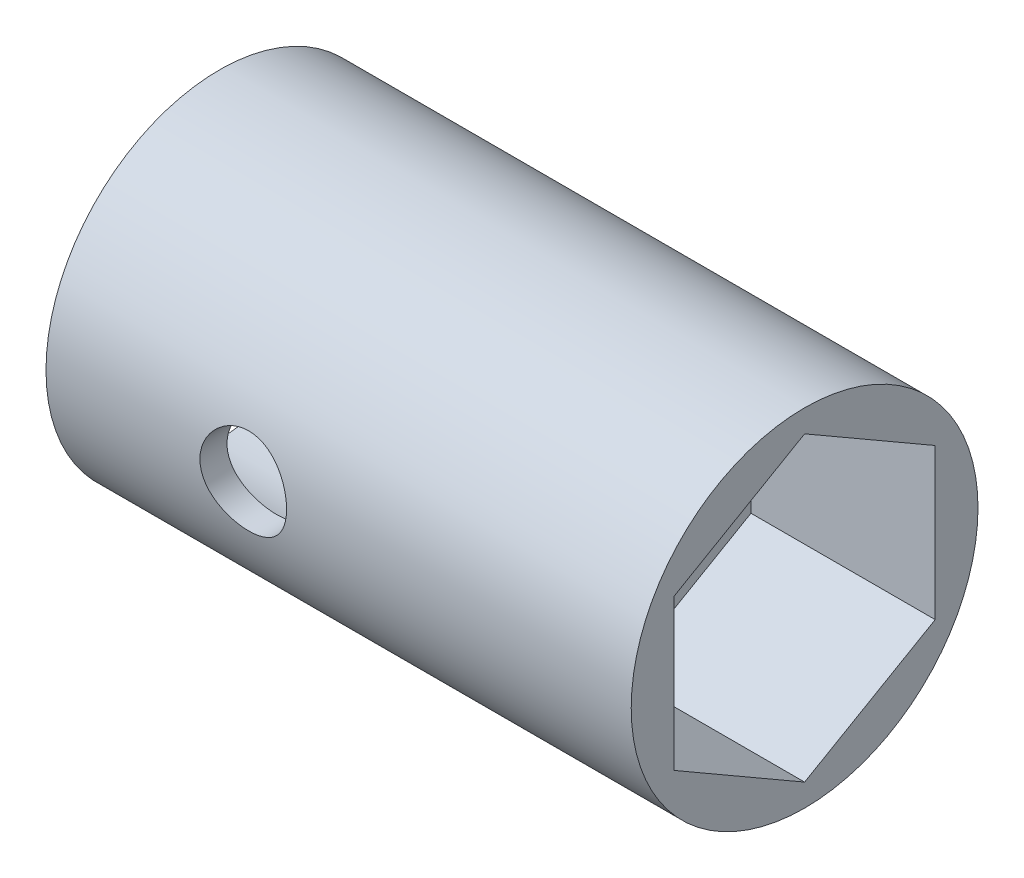
ISO-10303-21;
HEADER;
FILE_DESCRIPTION(('STEP AP214'),'2;1');
FILE_NAME('part.step','',(''),(''),'','','');
FILE_SCHEMA(('AUTOMOTIVE_DESIGN { 1 0 10303 214 1 1 1 1 }'));
ENDSEC;
DATA;
#1=APPLICATION_CONTEXT('core data for automotive mechanical design processes');
#2=APPLICATION_PROTOCOL_DEFINITION('international standard','automotive_design',2000,#1);
#3=PRODUCT_CONTEXT('',#1,'mechanical');
#4=PRODUCT('Part','Part','',(#3));
#5=PRODUCT_RELATED_PRODUCT_CATEGORY('part','',(#4));
#6=PRODUCT_DEFINITION_FORMATION('','',#4);
#7=PRODUCT_DEFINITION_CONTEXT('part definition',#1,'design');
#8=PRODUCT_DEFINITION('design','',#6,#7);
#9=PRODUCT_DEFINITION_SHAPE('','',#8);
#10=(LENGTH_UNIT() NAMED_UNIT(*) SI_UNIT(.MILLI.,.METRE.));
#11=(NAMED_UNIT(*) PLANE_ANGLE_UNIT() SI_UNIT($,.RADIAN.));
#12=(NAMED_UNIT(*) SI_UNIT($,.STERADIAN.) SOLID_ANGLE_UNIT());
#13=UNCERTAINTY_MEASURE_WITH_UNIT(LENGTH_MEASURE(1.E-05),#10,'distance_accuracy_value','');
#14=(GEOMETRIC_REPRESENTATION_CONTEXT(3) GLOBAL_UNCERTAINTY_ASSIGNED_CONTEXT((#13)) GLOBAL_UNIT_ASSIGNED_CONTEXT((#10,
#11,#12)) REPRESENTATION_CONTEXT('',''));
#15=CARTESIAN_POINT('',(0.,0.,0.));
#16=DIRECTION('',(0.,0.,1.));
#17=DIRECTION('',(1.,0.,0.));
#18=AXIS2_PLACEMENT_3D('',#15,#16,#17);
#19=CARTESIAN_POINT('',(20.,0.,0.));
#20=DIRECTION('',(-1.,0.,0.));
#21=DIRECTION('',(0.,0.,1.));
#22=AXIS2_PLACEMENT_3D('',#19,#20,#21);
#23=CYLINDRICAL_SURFACE('',#22,8.);
#24=CARTESIAN_POINT('',(20.,0.,0.));
#25=DIRECTION('',(1.,0.,0.));
#26=DIRECTION('',(0.,0.,-1.));
#27=AXIS2_PLACEMENT_3D('',#24,#25,#26);
#28=CIRCLE('',#27,8.);
#29=CARTESIAN_POINT('',(20.,0.,-8.));
#30=VERTEX_POINT('',#29);
#31=EDGE_CURVE('E11',#30,#30,#28,.T.);
#32=ORIENTED_EDGE('',*,*,#31,.F.);
#33=EDGE_LOOP('',(#32));
#34=FACE_BOUND('',#33,.T.);
#35=CARTESIAN_POINT('',(0.0999999999999998,0.,-8.));
#36=CARTESIAN_POINT('',(0.100003100984211,0.110501451559641,-7.9999981315735));
#37=CARTESIAN_POINT('',(0.10918873436505,0.221037543774351,-7.99768770842435));
#38=CARTESIAN_POINT('',(0.145633535076007,0.438941765027377,-7.98869485106526));
#39=CARTESIAN_POINT('',(0.172902946050467,0.546308062494319,-7.98200993893301));
#40=CARTESIAN_POINT('',(0.244585671282781,0.754694496243436,-7.96500835109376));
#41=CARTESIAN_POINT('',(0.288978398287026,0.855722084573336,-7.95469603789411));
#42=CARTESIAN_POINT('',(0.393575186726456,1.04889617587257,-7.93153791743495));
#43=CARTESIAN_POINT('',(0.453779781491956,1.14104237913168,-7.91869202472209));
#44=CARTESIAN_POINT('',(0.589601052872241,1.31573590306789,-7.89156551455591));
#45=CARTESIAN_POINT('',(0.665482099945414,1.39807425341474,-7.87726276197502));
#46=CARTESIAN_POINT('',(0.829936273212046,1.54899856960443,-7.84898160157248));
#47=CARTESIAN_POINT('',(0.918510830595915,1.61758298259892,-7.83500323053157));
#48=CARTESIAN_POINT('',(1.10746030231599,1.74003539039863,-7.80873034264225));
#49=CARTESIAN_POINT('',(1.20799097441164,1.79366962123352,-7.79646392619748));
#50=CARTESIAN_POINT('',(1.41699788221338,1.88319587806766,-7.77532659757355));
#51=CARTESIAN_POINT('',(1.52547284444269,1.91909074058685,-7.76645514259225));
#52=CARTESIAN_POINT('',(1.74499133093555,1.97140644907302,-7.7533396892843));
#53=CARTESIAN_POINT('',(1.85593986138399,1.98820302444274,-7.74900654662681));
#54=CARTESIAN_POINT('',(2.07915809199913,2.00301570008855,-7.74519149946122));
#55=CARTESIAN_POINT('',(2.19142757425618,2.00103485575748,-7.74570880570571));
#56=CARTESIAN_POINT('',(2.4112210769938,1.97864869951961,-7.75145607355756));
#57=CARTESIAN_POINT('',(2.51879416195377,1.95869112025418,-7.75657150676391));
#58=CARTESIAN_POINT('',(2.72901473454808,1.90163224920399,-7.77075612894758));
#59=CARTESIAN_POINT('',(2.83166187070523,1.86452973609252,-7.77982559958985));
#60=CARTESIAN_POINT('',(3.03031735500284,1.77385263724958,-7.80100151874212));
#61=CARTESIAN_POINT('',(3.12624822905276,1.72011555631056,-7.81313769959755));
#62=CARTESIAN_POINT('',(3.30789161300909,1.59780836801993,-7.83906281127988));
#63=CARTESIAN_POINT('',(3.39360233075634,1.52923566507845,-7.85285203112837));
#64=CARTESIAN_POINT('',(3.55493815425921,1.37688456624163,-7.88101174053188));
#65=CARTESIAN_POINT('',(3.63020598674847,1.29272834422115,-7.89538759304001));
#66=CARTESIAN_POINT('',(3.7656283232852,1.11281589000493,-7.92274620771675));
#67=CARTESIAN_POINT('',(3.82578236568475,1.01705930361059,-7.93572892732543));
#68=CARTESIAN_POINT('',(3.92940078163252,0.816154518241856,-7.9589030945892));
#69=CARTESIAN_POINT('',(3.97280712033924,0.710975190944831,-7.96908480170303));
#70=CARTESIAN_POINT('',(4.04122307427943,0.49450134419051,-7.98543889321888));
#71=CARTESIAN_POINT('',(4.06623620855752,0.383207998867312,-7.99161204452374));
#72=CARTESIAN_POINT('',(4.09661008741178,0.160719960520035,-7.999139990285));
#73=CARTESIAN_POINT('',(4.1024573681004,0.0495956266509453,-8.00061404677705));
#74=CARTESIAN_POINT('',(4.09566799725935,-0.172043833068678,-7.99891739752601));
#75=CARTESIAN_POINT('',(4.08303300960116,-0.282559012859461,-7.99574710989128));
#76=CARTESIAN_POINT('',(4.04003878881149,-0.498152358368656,-7.98519441503143));
#77=CARTESIAN_POINT('',(4.00994498203069,-0.603286825291673,-7.97787512247748));
#78=CARTESIAN_POINT('',(3.93319055462874,-0.807009723270015,-7.95984942178845));
#79=CARTESIAN_POINT('',(3.88652826091577,-0.905597492043513,-7.94914267159856));
#80=CARTESIAN_POINT('',(3.7770184948337,-1.0953641792398,-7.92524410568414));
#81=CARTESIAN_POINT('',(3.71389851680432,-1.18638058911444,-7.91201156489243));
#82=CARTESIAN_POINT('',(3.57361345493737,-1.35670215152433,-7.88459345583226));
#83=CARTESIAN_POINT('',(3.49644594717746,-1.43600527863068,-7.87040772335606));
#84=CARTESIAN_POINT('',(3.32799738554071,-1.58265409076364,-7.84225275947695));
#85=CARTESIAN_POINT('',(3.23641639599677,-1.64965849016271,-7.82829738916375));
#86=CARTESIAN_POINT('',(3.04302315404571,-1.7673476786836,-7.80257171169652));
#87=CARTESIAN_POINT('',(2.94121135605366,-1.81803319221058,-7.79080130756035));
#88=CARTESIAN_POINT('',(2.7307923701159,-1.90126856081239,-7.77090792979553));
#89=CARTESIAN_POINT('',(2.62222982887466,-1.93392586220542,-7.76276340389207));
#90=CARTESIAN_POINT('',(2.40092048281452,-1.98046087993837,-7.75102325453578));
#91=CARTESIAN_POINT('',(2.28817459862335,-1.99434270330488,-7.74742663626581));
#92=CARTESIAN_POINT('',(2.06517196819306,-2.00271812044533,-7.74526534938609));
#93=CARTESIAN_POINT('',(1.95493675316703,-1.99775719704016,-7.74655910304352));
#94=CARTESIAN_POINT('',(1.73692814844269,-1.96983637108382,-7.7537054534379));
#95=CARTESIAN_POINT('',(1.62915470931513,-1.94687683024903,-7.75955795855809));
#96=CARTESIAN_POINT('',(1.41972205457946,-1.88390842592373,-7.77508347576963));
#97=CARTESIAN_POINT('',(1.31803025967972,-1.84400187290717,-7.78473353648412));
#98=CARTESIAN_POINT('',(1.12271282304841,-1.74835321814009,-7.80677007633105));
#99=CARTESIAN_POINT('',(1.02908830241744,-1.69260892004558,-7.81915693494364));
#100=CARTESIAN_POINT('',(0.849927161330639,-1.56515699818285,-7.8456751235135));
#101=CARTESIAN_POINT('',(0.764665235434722,-1.49307088388301,-7.85984353109009));
#102=CARTESIAN_POINT('',(0.607270606939457,-1.33571916158631,-7.88810702995048));
#103=CARTESIAN_POINT('',(0.535141026516041,-1.25045042834819,-7.90220210302746));
#104=CARTESIAN_POINT('',(0.404784921913857,-1.06729011560345,-7.92903540863551));
#105=CARTESIAN_POINT('',(0.346833848437894,-0.969197896421849,-7.94174444487824));
#106=CARTESIAN_POINT('',(0.248336716079293,-0.764354746013968,-7.96406566633491));
#107=CARTESIAN_POINT('',(0.207778185801952,-0.657610084582319,-7.97368006933042));
#108=CARTESIAN_POINT('',(0.151237559560462,-0.459213670991295,-7.98730746087389));
#109=CARTESIAN_POINT('',(0.132065009262089,-0.368506894544091,-7.9920344673692));
#110=CARTESIAN_POINT('',(0.106445408504078,-0.185208095381711,-7.99838140309264));
#111=CARTESIAN_POINT('',(0.0999974009262649,-0.0926162149901548,-8.00000156601193));
#112=CARTESIAN_POINT('',(0.0999999999999998,0.,-8.));
#113=B_SPLINE_CURVE_WITH_KNOTS('',3,(#35,#36,#37,#38,#39,#40,#41,#42,#43,#44,#45,#46,#47,#48,
#49,#50,#51,#52,#53,#54,#55,#56,#57,#58,#59,#60,#61,#62,#63,#64,#65,#66,#67,#68,#69,#70,#71,#72,
#73,#74,#75,#76,#77,#78,#79,#80,#81,#82,#83,#84,#85,#86,#87,#88,#89,#90,#91,#92,#93,#94,#95,#96,
#97,#98,#99,#100,#101,#102,#103,#104,#105,#106,#107,#108,#109,#110,#111,#112),.UNSPECIFIED.,.T.,
.F.,(4,2,2,2,2,2,2,2,2,2,2,2,2,2,2,2,2,2,2,2,2,2,2,2,2,2,2,2,2,2,2,2,2,2,2,2,2,2,4),(0.,
0.33116494996252,0.662517650351866,0.993473203048141,1.32443992022577,1.66152580582852,
1.99864972773416,2.34078196727742,2.68285948225824,3.01808393468093,3.3532538415469,
3.68029996013785,4.00736937959146,4.337740371696,4.66816921119311,5.00802001296453,
5.34788119415424,5.6889097201658,6.02987298255951,6.36211078603463,6.69431868154751,
7.02160366023144,7.34892169767482,7.68204783424897,8.01523150681786,8.35659345610396,
8.69794025003772,9.03723006156476,9.37644564340971,9.70591707202578,10.0353818794581,
10.3628853408369,10.6904342418696,11.0265276855097,11.3627009303165,11.7049624733721,
12.0469781843289,12.3245632392729,12.6021274139515),.UNSPECIFIED.);
#114=CARTESIAN_POINT('',(0.0999999999999998,0.,-8.));
#115=VERTEX_POINT('',#114);
#116=EDGE_CURVE('E184',#115,#115,#113,.T.);
#117=ORIENTED_EDGE('',*,*,#116,.F.);
#118=EDGE_LOOP('',(#117));
#119=FACE_BOUND('',#118,.T.);
#120=CARTESIAN_POINT('',(4.1,0.,8.));
#121=CARTESIAN_POINT('',(4.09999689901579,0.110501451559641,7.9999981315735));
#122=CARTESIAN_POINT('',(4.09081126563495,0.221037543774351,7.99768770842435));
#123=CARTESIAN_POINT('',(4.05436646492399,0.438941765027377,7.98869485106526));
#124=CARTESIAN_POINT('',(4.02709705394953,0.546308062494319,7.98200993893301));
#125=CARTESIAN_POINT('',(3.95541432871722,0.754694496243436,7.96500835109376));
#126=CARTESIAN_POINT('',(3.91102160171297,0.855722084573337,7.95469603789411));
#127=CARTESIAN_POINT('',(3.80642481327354,1.04889617587257,7.93153791743495));
#128=CARTESIAN_POINT('',(3.74622021850804,1.14104237913168,7.91869202472209));
#129=CARTESIAN_POINT('',(3.61039894712776,1.31573590306789,7.89156551455591));
#130=CARTESIAN_POINT('',(3.53451790005459,1.39807425341474,7.87726276197502));
#131=CARTESIAN_POINT('',(3.37006372678795,1.54899856960443,7.84898160157248));
#132=CARTESIAN_POINT('',(3.28148916940409,1.61758298259892,7.83500323053157));
#133=CARTESIAN_POINT('',(3.09253969768401,1.74003539039863,7.80873034264225));
#134=CARTESIAN_POINT('',(2.99200902558836,1.79366962123352,7.79646392619748));
#135=CARTESIAN_POINT('',(2.78300211778662,1.88319587806766,7.77532659757355));
#136=CARTESIAN_POINT('',(2.67452715555731,1.91909074058685,7.76645514259225));
#137=CARTESIAN_POINT('',(2.45500866906445,1.97140644907302,7.7533396892843));
#138=CARTESIAN_POINT('',(2.34406013861601,1.98820302444274,7.74900654662681));
#139=CARTESIAN_POINT('',(2.12084190800087,2.00301570008855,7.74519149946122));
#140=CARTESIAN_POINT('',(2.00857242574382,2.00103485575748,7.74570880570571));
#141=CARTESIAN_POINT('',(1.7887789230062,1.97864869951961,7.75145607355756));
#142=CARTESIAN_POINT('',(1.68120583804623,1.95869112025418,7.75657150676391));
#143=CARTESIAN_POINT('',(1.47098526545192,1.90163224920399,7.77075612894758));
#144=CARTESIAN_POINT('',(1.36833812929477,1.86452973609252,7.77982559958985));
#145=CARTESIAN_POINT('',(1.16968264499716,1.77385263724958,7.80100151874212));
#146=CARTESIAN_POINT('',(1.07375177094724,1.72011555631056,7.81313769959755));
#147=CARTESIAN_POINT('',(0.892108386990906,1.59780836801993,7.83906281127988));
#148=CARTESIAN_POINT('',(0.806397669243665,1.52923566507845,7.85285203112837));
#149=CARTESIAN_POINT('',(0.645061845740794,1.37688456624163,7.88101174053188));
#150=CARTESIAN_POINT('',(0.569794013251532,1.29272834422115,7.89538759304001));
#151=CARTESIAN_POINT('',(0.434371676714796,1.11281589000493,7.92274620771675));
#152=CARTESIAN_POINT('',(0.374217634315246,1.01705930361059,7.93572892732543));
#153=CARTESIAN_POINT('',(0.270599218367485,0.816154518241856,7.9589030945892));
#154=CARTESIAN_POINT('',(0.227192879660763,0.710975190944831,7.96908480170303));
#155=CARTESIAN_POINT('',(0.15877692572057,0.49450134419051,7.98543889321888));
#156=CARTESIAN_POINT('',(0.133763791442483,0.383207998867313,7.99161204452374));
#157=CARTESIAN_POINT('',(0.103389912588216,0.160719960520036,7.999139990285));
#158=CARTESIAN_POINT('',(0.097542631899598,0.0495956266509466,8.00061404677705));
#159=CARTESIAN_POINT('',(0.104332002740649,-0.172043833068677,7.99891739752601));
#160=CARTESIAN_POINT('',(0.116966990398843,-0.28255901285946,7.99574710989128));
#161=CARTESIAN_POINT('',(0.159961211188506,-0.498152358368656,7.98519441503143));
#162=CARTESIAN_POINT('',(0.190055017969316,-0.603286825291673,7.97787512247748));
#163=CARTESIAN_POINT('',(0.266809445371262,-0.807009723270016,7.95984942178845));
#164=CARTESIAN_POINT('',(0.313471739084227,-0.905597492043513,7.94914267159856));
#165=CARTESIAN_POINT('',(0.422981505166304,-1.0953641792398,7.92524410568414));
#166=CARTESIAN_POINT('',(0.486101483195683,-1.18638058911444,7.91201156489243));
#167=CARTESIAN_POINT('',(0.626386545062626,-1.35670215152433,7.88459345583226));
#168=CARTESIAN_POINT('',(0.703554052822543,-1.43600527863068,7.87040772335606));
#169=CARTESIAN_POINT('',(0.872002614459285,-1.58265409076364,7.84225275947695));
#170=CARTESIAN_POINT('',(0.963583604003229,-1.64965849016271,7.82829738916375));
#171=CARTESIAN_POINT('',(1.15697684595429,-1.7673476786836,7.80257171169652));
#172=CARTESIAN_POINT('',(1.25878864394634,-1.81803319221058,7.79080130756035));
#173=CARTESIAN_POINT('',(1.4692076298841,-1.90126856081239,7.77090792979553));
#174=CARTESIAN_POINT('',(1.57777017112535,-1.93392586220542,7.76276340389207));
#175=CARTESIAN_POINT('',(1.79907951718548,-1.98046087993837,7.75102325453578));
#176=CARTESIAN_POINT('',(1.91182540137665,-1.99434270330488,7.74742663626581));
#177=CARTESIAN_POINT('',(2.13482803180694,-2.00271812044533,7.74526534938609));
#178=CARTESIAN_POINT('',(2.24506324683298,-1.99775719704016,7.74655910304351));
#179=CARTESIAN_POINT('',(2.46307185155731,-1.96983637108382,7.7537054534379));
#180=CARTESIAN_POINT('',(2.57084529068487,-1.94687683024903,7.75955795855809));
#181=CARTESIAN_POINT('',(2.78027794542055,-1.88390842592373,7.77508347576963));
#182=CARTESIAN_POINT('',(2.88196974032028,-1.84400187290717,7.78473353648412));
#183=CARTESIAN_POINT('',(3.07728717695159,-1.74835321814009,7.80677007633105));
#184=CARTESIAN_POINT('',(3.17091169758256,-1.69260892004558,7.81915693494364));
#185=CARTESIAN_POINT('',(3.35007283866936,-1.56515699818285,7.8456751235135));
#186=CARTESIAN_POINT('',(3.43533476456528,-1.49307088388301,7.85984353109009));
#187=CARTESIAN_POINT('',(3.59272939306054,-1.33571916158631,7.88810702995048));
#188=CARTESIAN_POINT('',(3.66485897348396,-1.25045042834819,7.90220210302746));
#189=CARTESIAN_POINT('',(3.79521507808614,-1.06729011560345,7.92903540863551));
#190=CARTESIAN_POINT('',(3.85316615156211,-0.969197896421848,7.94174444487824));
#191=CARTESIAN_POINT('',(3.95166328392071,-0.764354746013968,7.96406566633491));
#192=CARTESIAN_POINT('',(3.99222181419805,-0.657610084582319,7.97368006933042));
#193=CARTESIAN_POINT('',(4.04876244043954,-0.459213670991296,7.98730746087389));
#194=CARTESIAN_POINT('',(4.06793499073791,-0.368506894544092,7.9920344673692));
#195=CARTESIAN_POINT('',(4.09355459149592,-0.185208095381711,7.99838140309264));
#196=CARTESIAN_POINT('',(4.10000259907374,-0.0926162149901553,8.00000156601192));
#197=CARTESIAN_POINT('',(4.1,0.,8.));
#198=B_SPLINE_CURVE_WITH_KNOTS('',3,(#120,#121,#122,#123,#124,#125,#126,#127,#128,#129,#130,
#131,#132,#133,#134,#135,#136,#137,#138,#139,#140,#141,#142,#143,#144,#145,#146,#147,#148,#149,
#150,#151,#152,#153,#154,#155,#156,#157,#158,#159,#160,#161,#162,#163,#164,#165,#166,#167,#168,
#169,#170,#171,#172,#173,#174,#175,#176,#177,#178,#179,#180,#181,#182,#183,#184,#185,#186,#187,
#188,#189,#190,#191,#192,#193,#194,#195,#196,#197),.UNSPECIFIED.,.T.,.F.,(4,2,2,2,2,2,2,2,2,2,2,
2,2,2,2,2,2,2,2,2,2,2,2,2,2,2,2,2,2,2,2,2,2,2,2,2,2,2,4),(0.,0.33116494996252,0.662517650351866,
0.993473203048142,1.32443992022577,1.66152580582852,1.99864972773416,2.34078196727742,
2.68285948225824,3.01808393468093,3.3532538415469,3.68029996013785,4.00736937959146,
4.337740371696,4.66816921119311,5.00802001296454,5.34788119415424,5.6889097201658,
6.02987298255951,6.36211078603463,6.69431868154752,7.02160366023144,7.34892169767482,
7.68204783424897,8.01523150681786,8.35659345610396,8.69794025003772,9.03723006156476,
9.37644564340972,9.70591707202578,10.0353818794581,10.3628853408369,10.6904342418696,
11.0265276855097,11.3627009303165,11.7049624733721,12.0469781843289,12.3245632392729,
12.6021274139515),.UNSPECIFIED.);
#199=CARTESIAN_POINT('',(4.1,0.,8.));
#200=VERTEX_POINT('',#199);
#201=EDGE_CURVE('E178',#200,#200,#198,.T.);
#202=ORIENTED_EDGE('',*,*,#201,.F.);
#203=EDGE_LOOP('',(#202));
#204=FACE_BOUND('',#203,.T.);
#205=CARTESIAN_POINT('',(-7.,0.,0.));
#206=DIRECTION('',(-1.,0.,0.));
#207=DIRECTION('',(0.,0.,1.));
#208=AXIS2_PLACEMENT_3D('',#205,#206,#207);
#209=CIRCLE('',#208,8.);
#210=CARTESIAN_POINT('',(-7.,0.,8.));
#211=VERTEX_POINT('',#210);
#212=EDGE_CURVE('E159',#211,#211,#209,.T.);
#213=ORIENTED_EDGE('',*,*,#212,.F.);
#214=EDGE_LOOP('',(#213));
#215=FACE_BOUND('',#214,.T.);
#216=ADVANCED_FACE('F41',(#34,#119,#204,#215),#23,.T.);
#217=CARTESIAN_POINT('',(9.,0.,0.));
#218=DIRECTION('',(-1.,0.,0.));
#219=DIRECTION('',(0.,0.,1.));
#220=AXIS2_PLACEMENT_3D('',#217,#218,#219);
#221=CYLINDRICAL_SURFACE('',#220,6.75);
#222=CARTESIAN_POINT('',(9.,0.,0.));
#223=DIRECTION('',(-1.,0.,0.));
#224=DIRECTION('',(0.,0.,1.));
#225=AXIS2_PLACEMENT_3D('',#222,#223,#224);
#226=CIRCLE('',#225,6.75);
#227=CARTESIAN_POINT('',(9.,0.,6.75));
#228=VERTEX_POINT('',#227);
#229=EDGE_CURVE('E137',#228,#228,#226,.T.);
#230=ORIENTED_EDGE('',*,*,#229,.F.);
#231=EDGE_LOOP('',(#230));
#232=FACE_BOUND('',#231,.T.);
#233=CARTESIAN_POINT('',(0.0999999999999998,0.,-6.75));
#234=CARTESIAN_POINT('',(0.10000149715843,-0.109780507827997,-6.74999895357174));
#235=CARTESIAN_POINT('',(0.109068831798243,-0.219576188157135,-6.74729613961413));
#236=CARTESIAN_POINT('',(0.14501508421599,-0.435974163095877,-6.7367779386325));
#237=CARTESIAN_POINT('',(0.171899688682122,-0.542575426794903,-6.72896091933207));
#238=CARTESIAN_POINT('',(0.242506928934581,-0.749431834060114,-6.70907157188689));
#239=CARTESIAN_POINT('',(0.286205080089608,-0.849695959996787,-6.69700543365303));
#240=CARTESIAN_POINT('',(0.389099680831353,-1.04147390890969,-6.66987440163433));
#241=CARTESIAN_POINT('',(0.448298078416304,-1.13298663007551,-6.65480913098969));
#242=CARTESIAN_POINT('',(0.582264443327024,-1.30723335618362,-6.62281609852056));
#243=CARTESIAN_POINT('',(0.65738820028468,-1.38968692651201,-6.60585087876647));
#244=CARTESIAN_POINT('',(0.820314246115938,-1.54102903218837,-6.57219540945145));
#245=CARTESIAN_POINT('',(0.908118601460149,-1.60991535224076,-6.55550520520277));
#246=CARTESIAN_POINT('',(1.09627052395405,-1.73363046162767,-6.52389477512094));
#247=CARTESIAN_POINT('',(1.1968502107566,-1.78811926435753,-6.50902118305508));
#248=CARTESIAN_POINT('',(1.40625680566745,-1.8792957384254,-6.48328681863478));
#249=CARTESIAN_POINT('',(1.51508178127396,-1.91598756612525,-6.47242510947398));
#250=CARTESIAN_POINT('',(1.7347455188595,-1.969521633465,-6.45633424438028));
#251=CARTESIAN_POINT('',(1.8454475302766,-1.98687991736363,-6.45095899226571));
#252=CARTESIAN_POINT('',(2.06831291856374,-2.00286530285513,-6.44601480296172));
#253=CARTESIAN_POINT('',(2.1804759448867,-2.00149681784523,-6.4464444977017));
#254=CARTESIAN_POINT('',(2.3989032306458,-1.9804733446018,-6.45293201970745));
#255=CARTESIAN_POINT('',(2.50523631699897,-1.96146221318409,-6.45879167330767));
#256=CARTESIAN_POINT('',(2.71313057795556,-1.90673230983323,-6.47515865740568));
#257=CARTESIAN_POINT('',(2.81469129100795,-1.87101192554119,-6.48566643641889));
#258=CARTESIAN_POINT('',(3.0117446749685,-1.78339749199776,-6.51030570383787));
#259=CARTESIAN_POINT('',(3.10713754013038,-1.73129268359001,-6.52448396112886));
#260=CARTESIAN_POINT('',(3.2880427286368,-1.61253500191672,-6.55484386592104));
#261=CARTESIAN_POINT('',(3.37355270084538,-1.54587867770291,-6.57102598825196));
#262=CARTESIAN_POINT('',(3.53591988091854,-1.39670138313682,-6.60437650489371));
#263=CARTESIAN_POINT('',(3.61228355780654,-1.31364532643575,-6.62155824094315));
#264=CARTESIAN_POINT('',(3.75011192695319,-1.13569229790269,-6.65438787229502));
#265=CARTESIAN_POINT('',(3.81157572675327,-1.04079461730789,-6.67003567568601));
#266=CARTESIAN_POINT('',(3.91814943184287,-0.840970715212555,-6.69817136452503));
#267=CARTESIAN_POINT('',(3.96315221323084,-0.735984228183308,-6.71063839704817));
#268=CARTESIAN_POINT('',(4.03471750391585,-0.519478083537604,-6.73085759101367));
#269=CARTESIAN_POINT('',(4.06128502555762,-0.407960210682307,-6.73861103395821));
#270=CARTESIAN_POINT('',(4.09440946837884,-0.185754367320837,-6.74832777999005));
#271=CARTESIAN_POINT('',(4.10163550113185,-0.0751744544281653,-6.75048461171956));
#272=CARTESIAN_POINT('',(4.09774405827455,0.145624015554763,-6.74933156704897));
#273=CARTESIAN_POINT('',(4.08662896556578,0.255842617722871,-6.74602240079799));
#274=CARTESIAN_POINT('',(4.04691283920459,0.47028029628697,-6.7344357004489));
#275=CARTESIAN_POINT('',(4.01870071742248,0.574577941871162,-6.7262687424719));
#276=CARTESIAN_POINT('',(3.94605738234879,0.776938410671505,-6.70590917298922));
#277=CARTESIAN_POINT('',(3.90162423736637,0.875000489687504,-6.69371608204546));
#278=CARTESIAN_POINT('',(3.79666344991328,1.06458432647057,-6.66622462760101));
#279=CARTESIAN_POINT('',(3.73579258195568,1.15590648191309,-6.65086191667895));
#280=CARTESIAN_POINT('',(3.60010292386749,1.32726877958423,-6.61879673108033));
#281=CARTESIAN_POINT('',(3.52528072192429,1.40730615368216,-6.60209392925366));
#282=CARTESIAN_POINT('',(3.36067029259632,1.55675893312647,-6.56849170341841));
#283=CARTESIAN_POINT('',(3.27044639404355,1.62569863061477,-6.55160621339354));
#284=CARTESIAN_POINT('',(3.07934417181999,1.74748984960258,-6.52018017865221));
#285=CARTESIAN_POINT('',(2.97846615464799,1.80034183374537,-6.50563956650847));
#286=CARTESIAN_POINT('',(2.76926850131597,1.88808842707279,-6.48071797240951));
#287=CARTESIAN_POINT('',(2.66098792376821,1.92307011535889,-6.47031687516707));
#288=CARTESIAN_POINT('',(2.43970895756673,1.97420394917346,-6.45490091242077));
#289=CARTESIAN_POINT('',(2.32671214839195,1.99036234708587,-6.44988425845241));
#290=CARTESIAN_POINT('',(2.10414143679812,2.0029730578667,-6.44597836214003));
#291=CARTESIAN_POINT('',(1.9946150368895,2.00019948383777,-6.44684840439167));
#292=CARTESIAN_POINT('',(1.77766507875995,1.97686673394052,-6.45404087889644));
#293=CARTESIAN_POINT('',(1.67024144031023,1.95630823799625,-6.46036310271066));
#294=CARTESIAN_POINT('',(1.46177771659453,1.89848338352936,-6.47758812520025));
#295=CARTESIAN_POINT('',(1.36067722204207,1.8614172236977,-6.48843594234712));
#296=CARTESIAN_POINT('',(1.16604945089095,1.77178472154567,-6.51348097902859));
#297=CARTESIAN_POINT('',(1.07252360018912,1.71921546943393,-6.52767882723387));
#298=CARTESIAN_POINT('',(0.8920955610543,1.59787466680532,-6.55845570703591));
#299=CARTESIAN_POINT('',(0.805548156149833,1.52859251647181,-6.5751015613966));
#300=CARTESIAN_POINT('',(0.645056838790198,1.37671764046891,-6.60856912953431));
#301=CARTESIAN_POINT('',(0.571116178848342,1.29412149047669,-6.6253908875096));
#302=CARTESIAN_POINT('',(0.435856780469725,1.11514975355066,-6.65788498158106));
#303=CARTESIAN_POINT('',(0.374954021229614,1.01845059715654,-6.67351137161211));
#304=CARTESIAN_POINT('',(0.270357529817768,0.815722252703583,-6.70130862680841));
#305=CARTESIAN_POINT('',(0.22665538642997,0.709697655959117,-6.71348118010808));
#306=CARTESIAN_POINT('',(0.161830389149086,0.503779578000332,-6.73187584792081));
#307=CARTESIAN_POINT('',(0.138705726549971,0.404558947214438,-6.73861704128744));
#308=CARTESIAN_POINT('',(0.107791048055051,0.203562954982656,-6.74767925362443));
#309=CARTESIAN_POINT('',(0.0999986118413519,0.101787999327255,-6.75000097024364));
#310=CARTESIAN_POINT('',(0.0999999999999998,0.,-6.75));
#311=B_SPLINE_CURVE_WITH_KNOTS('',3,(#233,#234,#235,#236,#237,#238,#239,#240,#241,#242,#243,
#244,#245,#246,#247,#248,#249,#250,#251,#252,#253,#254,#255,#256,#257,#258,#259,#260,#261,#262,
#263,#264,#265,#266,#267,#268,#269,#270,#271,#272,#273,#274,#275,#276,#277,#278,#279,#280,#281,
#282,#283,#284,#285,#286,#287,#288,#289,#290,#291,#292,#293,#294,#295,#296,#297,#298,#299,#300,
#301,#302,#303,#304,#305,#306,#307,#308,#309,#310),.UNSPECIFIED.,.T.,.F.,(4,2,2,2,2,2,2,2,2,2,2,
2,2,2,2,2,2,2,2,2,2,2,2,2,2,2,2,2,2,2,2,2,2,2,2,2,2,2,4),(0.,0.32896770489655,0.65804045609361,
0.986635799666841,1.31527245939874,1.65221766342732,1.98921783920761,2.33358031728811,
2.67786233309663,3.01271657391682,3.34749189993188,3.67051088328315,3.99356104277411,
4.320949543795,4.64841577077394,4.98920393821032,5.3300125128093,5.67300109750929,
6.01589639080055,6.34676605629498,6.67759273818107,7.00116255654673,7.3247709200054,
7.65574304318969,7.98679621234534,8.32955627438705,8.67230647855637,9.01337019107239,
9.35432058281283,9.68141576699804,10.0084984467677,10.3317180629328,10.6549983831726,
10.9897984380869,11.324684740422,11.6690395665297,12.0132257909865,12.3182913470032,
12.6233087420508),.UNSPECIFIED.);
#312=CARTESIAN_POINT('',(0.0999999999999998,0.,-6.75));
#313=VERTEX_POINT('',#312);
#314=EDGE_CURVE('E154',#313,#313,#311,.T.);
#315=ORIENTED_EDGE('',*,*,#314,.F.);
#316=EDGE_LOOP('',(#315));
#317=FACE_BOUND('',#316,.T.);
#318=CARTESIAN_POINT('',(4.1,0.,6.75));
#319=CARTESIAN_POINT('',(4.09999850284157,-0.109780507827997,6.74999895357174));
#320=CARTESIAN_POINT('',(4.09093116820176,-0.219576188157135,6.74729613961413));
#321=CARTESIAN_POINT('',(4.05498491578401,-0.435974163095877,6.7367779386325));
#322=CARTESIAN_POINT('',(4.02810031131788,-0.542575426794903,6.72896091933207));
#323=CARTESIAN_POINT('',(3.95749307106542,-0.749431834060114,6.70907157188689));
#324=CARTESIAN_POINT('',(3.91379491991039,-0.849695959996787,6.69700543365303));
#325=CARTESIAN_POINT('',(3.81090031916865,-1.04147390890969,6.66987440163433));
#326=CARTESIAN_POINT('',(3.7517019215837,-1.13298663007551,6.65480913098969));
#327=CARTESIAN_POINT('',(3.61773555667298,-1.30723335618362,6.62281609852056));
#328=CARTESIAN_POINT('',(3.54261179971532,-1.38968692651201,6.60585087876647));
#329=CARTESIAN_POINT('',(3.37968575388406,-1.54102903218837,6.57219540945145));
#330=CARTESIAN_POINT('',(3.29188139853985,-1.60991535224076,6.55550520520277));
#331=CARTESIAN_POINT('',(3.10372947604595,-1.73363046162767,6.52389477512094));
#332=CARTESIAN_POINT('',(3.00314978924341,-1.78811926435753,6.50902118305508));
#333=CARTESIAN_POINT('',(2.79374319433255,-1.8792957384254,6.48328681863478));
#334=CARTESIAN_POINT('',(2.68491821872604,-1.91598756612525,6.47242510947398));
#335=CARTESIAN_POINT('',(2.4652544811405,-1.969521633465,6.45633424438028));
#336=CARTESIAN_POINT('',(2.3545524697234,-1.98687991736363,6.45095899226571));
#337=CARTESIAN_POINT('',(2.13168708143626,-2.00286530285513,6.44601480296172));
#338=CARTESIAN_POINT('',(2.0195240551133,-2.00149681784523,6.4464444977017));
#339=CARTESIAN_POINT('',(1.8010967693542,-1.9804733446018,6.45293201970745));
#340=CARTESIAN_POINT('',(1.69476368300103,-1.96146221318409,6.45879167330767));
#341=CARTESIAN_POINT('',(1.48686942204444,-1.90673230983323,6.47515865740568));
#342=CARTESIAN_POINT('',(1.38530870899205,-1.87101192554119,6.48566643641889));
#343=CARTESIAN_POINT('',(1.1882553250315,-1.78339749199776,6.51030570383787));
#344=CARTESIAN_POINT('',(1.09286245986962,-1.73129268359001,6.52448396112886));
#345=CARTESIAN_POINT('',(0.911957271363205,-1.61253500191672,6.55484386592104));
#346=CARTESIAN_POINT('',(0.826447299154616,-1.54587867770291,6.57102598825196));
#347=CARTESIAN_POINT('',(0.664080119081463,-1.39670138313682,6.60437650489371));
#348=CARTESIAN_POINT('',(0.587716442193463,-1.31364532643575,6.62155824094315));
#349=CARTESIAN_POINT('',(0.44988807304681,-1.13569229790269,6.65438787229502));
#350=CARTESIAN_POINT('',(0.388424273246726,-1.04079461730789,6.67003567568601));
#351=CARTESIAN_POINT('',(0.281850568157132,-0.840970715212555,6.69817136452503));
#352=CARTESIAN_POINT('',(0.236847786769164,-0.735984228183308,6.71063839704817));
#353=CARTESIAN_POINT('',(0.165282496084147,-0.519478083537603,6.73085759101367));
#354=CARTESIAN_POINT('',(0.138714974442379,-0.407960210682307,6.73861103395821));
#355=CARTESIAN_POINT('',(0.10559053162116,-0.185754367320837,6.74832777999005));
#356=CARTESIAN_POINT('',(0.0983644988681535,-0.075174454428165,6.75048461171956));
#357=CARTESIAN_POINT('',(0.102255941725445,0.145624015554763,6.74933156704897));
#358=CARTESIAN_POINT('',(0.113371034434225,0.255842617722871,6.74602240079799));
#359=CARTESIAN_POINT('',(0.153087160795407,0.47028029628697,6.7344357004489));
#360=CARTESIAN_POINT('',(0.181299282577519,0.574577941871163,6.7262687424719));
#361=CARTESIAN_POINT('',(0.253942617651215,0.776938410671505,6.70590917298922));
#362=CARTESIAN_POINT('',(0.298375762633626,0.875000489687504,6.69371608204546));
#363=CARTESIAN_POINT('',(0.403336550086721,1.06458432647057,6.66622462760101));
#364=CARTESIAN_POINT('',(0.464207418044322,1.15590648191309,6.65086191667895));
#365=CARTESIAN_POINT('',(0.599897076132512,1.32726877958423,6.61879673108033));
#366=CARTESIAN_POINT('',(0.674719278075707,1.40730615368216,6.60209392925366));
#367=CARTESIAN_POINT('',(0.839329707403685,1.55675893312647,6.56849170341841));
#368=CARTESIAN_POINT('',(0.929553605956455,1.62569863061477,6.55160621339354));
#369=CARTESIAN_POINT('',(1.12065582818001,1.74748984960258,6.52018017865221));
#370=CARTESIAN_POINT('',(1.22153384535201,1.80034183374537,6.50563956650847));
#371=CARTESIAN_POINT('',(1.43073149868403,1.88808842707279,6.48071797240951));
#372=CARTESIAN_POINT('',(1.53901207623179,1.92307011535889,6.47031687516707));
#373=CARTESIAN_POINT('',(1.76029104243327,1.97420394917346,6.45490091242077));
#374=CARTESIAN_POINT('',(1.87328785160805,1.99036234708587,6.44988425845241));
#375=CARTESIAN_POINT('',(2.09585856320188,2.0029730578667,6.44597836214003));
#376=CARTESIAN_POINT('',(2.2053849631105,2.00019948383777,6.44684840439167));
#377=CARTESIAN_POINT('',(2.42233492124005,1.97686673394052,6.45404087889644));
#378=CARTESIAN_POINT('',(2.52975855968977,1.95630823799625,6.46036310271066));
#379=CARTESIAN_POINT('',(2.73822228340547,1.89848338352936,6.47758812520025));
#380=CARTESIAN_POINT('',(2.83932277795793,1.8614172236977,6.48843594234712));
#381=CARTESIAN_POINT('',(3.03395054910905,1.77178472154567,6.51348097902859));
#382=CARTESIAN_POINT('',(3.12747639981088,1.71921546943393,6.52767882723387));
#383=CARTESIAN_POINT('',(3.3079044389457,1.59787466680532,6.55845570703591));
#384=CARTESIAN_POINT('',(3.39445184385017,1.52859251647181,6.5751015613966));
#385=CARTESIAN_POINT('',(3.5549431612098,1.37671764046891,6.60856912953431));
#386=CARTESIAN_POINT('',(3.62888382115166,1.29412149047669,6.6253908875096));
#387=CARTESIAN_POINT('',(3.76414321953028,1.11514975355066,6.65788498158106));
#388=CARTESIAN_POINT('',(3.82504597877039,1.01845059715654,6.67351137161211));
#389=CARTESIAN_POINT('',(3.92964247018223,0.815722252703584,6.70130862680841));
#390=CARTESIAN_POINT('',(3.97334461357003,0.709697655959117,6.71348118010808));
#391=CARTESIAN_POINT('',(4.03816961085091,0.503779578000332,6.73187584792081));
#392=CARTESIAN_POINT('',(4.06129427345003,0.404558947214437,6.73861704128744));
#393=CARTESIAN_POINT('',(4.09220895194495,0.203562954982656,6.74767925362443));
#394=CARTESIAN_POINT('',(4.10000138815865,0.101787999327255,6.75000097024364));
#395=CARTESIAN_POINT('',(4.1,0.,6.75));
#396=B_SPLINE_CURVE_WITH_KNOTS('',3,(#318,#319,#320,#321,#322,#323,#324,#325,#326,#327,#328,
#329,#330,#331,#332,#333,#334,#335,#336,#337,#338,#339,#340,#341,#342,#343,#344,#345,#346,#347,
#348,#349,#350,#351,#352,#353,#354,#355,#356,#357,#358,#359,#360,#361,#362,#363,#364,#365,#366,
#367,#368,#369,#370,#371,#372,#373,#374,#375,#376,#377,#378,#379,#380,#381,#382,#383,#384,#385,
#386,#387,#388,#389,#390,#391,#392,#393,#394,#395),.UNSPECIFIED.,.T.,.F.,(4,2,2,2,2,2,2,2,2,2,2,
2,2,2,2,2,2,2,2,2,2,2,2,2,2,2,2,2,2,2,2,2,2,2,2,2,2,2,4),(0.,0.32896770489655,0.65804045609361,
0.986635799666841,1.31527245939874,1.65221766342732,1.98921783920761,2.33358031728811,
2.67786233309663,3.01271657391682,3.34749189993188,3.67051088328315,3.99356104277411,
4.320949543795,4.64841577077394,4.98920393821032,5.3300125128093,5.67300109750929,
6.01589639080056,6.34676605629498,6.67759273818107,7.00116255654673,7.3247709200054,
7.65574304318969,7.98679621234534,8.32955627438706,8.67230647855637,9.01337019107239,
9.35432058281283,9.68141576699804,10.0084984467677,10.3317180629328,10.6549983831726,
10.9897984380869,11.324684740422,11.6690395665297,12.0132257909865,12.3182913470032,
12.6233087420508),.UNSPECIFIED.);
#397=CARTESIAN_POINT('',(4.1,0.,6.75));
#398=VERTEX_POINT('',#397);
#399=EDGE_CURVE('E45',#398,#398,#396,.T.);
#400=ORIENTED_EDGE('',*,*,#399,.F.);
#401=EDGE_LOOP('',(#400));
#402=FACE_BOUND('',#401,.T.);
#403=CARTESIAN_POINT('',(-7.,0.,0.));
#404=DIRECTION('',(-1.,0.,0.));
#405=DIRECTION('',(0.,0.,1.));
#406=AXIS2_PLACEMENT_3D('',#403,#404,#405);
#407=CIRCLE('',#406,6.75);
#408=CARTESIAN_POINT('',(-7.,0.,6.75));
#409=VERTEX_POINT('',#408);
#410=EDGE_CURVE('E235',#409,#409,#407,.T.);
#411=ORIENTED_EDGE('',*,*,#410,.T.);
#412=EDGE_LOOP('',(#411));
#413=FACE_BOUND('',#412,.T.);
#414=ADVANCED_FACE('F160',(#232,#317,#402,#413),#221,.F.);
#415=CARTESIAN_POINT('',(20.,0.,0.));
#416=DIRECTION('',(1.,0.,0.));
#417=DIRECTION('',(0.,0.,-1.));
#418=AXIS2_PLACEMENT_3D('',#415,#416,#417);
#419=PLANE('',#418);
#420=DIRECTION('',(0.,-0.5,-0.866025403784439));
#421=VECTOR('',#420,1.);
#422=CARTESIAN_POINT('',(20.,-3.4785353718675,6.025));
#423=LINE('',#422,#421);
#424=CARTESIAN_POINT('',(20.,-3.4785353718675,6.025));
#425=VERTEX_POINT('',#424);
#426=CARTESIAN_POINT('',(20.,-6.95707074373499,0.));
#427=VERTEX_POINT('',#426);
#428=EDGE_CURVE('E63',#425,#427,#423,.T.);
#429=ORIENTED_EDGE('',*,*,#428,.F.);
#430=DIRECTION('',(0.,-1.,0.));
#431=VECTOR('',#430,1.);
#432=CARTESIAN_POINT('',(20.,3.4785353718675,6.025));
#433=LINE('',#432,#431);
#434=CARTESIAN_POINT('',(20.,3.4785353718675,6.025));
#435=VERTEX_POINT('',#434);
#436=EDGE_CURVE('E146',#435,#425,#433,.T.);
#437=ORIENTED_EDGE('',*,*,#436,.F.);
#438=DIRECTION('',(0.,-0.5,0.866025403784439));
#439=VECTOR('',#438,1.);
#440=CARTESIAN_POINT('',(20.,6.95707074373499,0.));
#441=LINE('',#440,#439);
#442=CARTESIAN_POINT('',(20.,6.95707074373499,0.));
#443=VERTEX_POINT('',#442);
#444=EDGE_CURVE('E144',#443,#435,#441,.T.);
#445=ORIENTED_EDGE('',*,*,#444,.F.);
#446=DIRECTION('',(0.,0.5,0.866025403784439));
#447=VECTOR('',#446,1.);
#448=CARTESIAN_POINT('',(20.,3.4785353718675,-6.025));
#449=LINE('',#448,#447);
#450=CARTESIAN_POINT('',(20.,3.4785353718675,-6.025));
#451=VERTEX_POINT('',#450);
#452=EDGE_CURVE('E110',#451,#443,#449,.T.);
#453=ORIENTED_EDGE('',*,*,#452,.F.);
#454=DIRECTION('',(0.,1.,0.));
#455=VECTOR('',#454,1.);
#456=CARTESIAN_POINT('',(20.,-3.4785353718675,-6.025));
#457=LINE('',#456,#455);
#458=CARTESIAN_POINT('',(20.,-3.4785353718675,-6.025));
#459=VERTEX_POINT('',#458);
#460=EDGE_CURVE('E140',#459,#451,#457,.T.);
#461=ORIENTED_EDGE('',*,*,#460,.F.);
#462=DIRECTION('',(0.,0.5,-0.866025403784439));
#463=VECTOR('',#462,1.);
#464=CARTESIAN_POINT('',(20.,-6.95707074373499,0.));
#465=LINE('',#464,#463);
#466=EDGE_CURVE('E136',#427,#459,#465,.T.);
#467=ORIENTED_EDGE('',*,*,#466,.F.);
#468=EDGE_LOOP('',(#429,#437,#445,#453,#461,#467));
#469=FACE_BOUND('',#468,.T.);
#470=ORIENTED_EDGE('',*,*,#31,.T.);
#471=EDGE_LOOP('',(#470));
#472=FACE_BOUND('',#471,.T.);
#473=ADVANCED_FACE('F206',(#469,#472),#419,.T.);
#474=CARTESIAN_POINT('',(11.5,-3.4785353718675,6.025));
#475=DIRECTION('',(0.,-0.866025403784439,0.5));
#476=DIRECTION('',(0.,-0.5,-0.866025403784439));
#477=AXIS2_PLACEMENT_3D('',#474,#475,#476);
#478=PLANE('',#477);
#479=ORIENTED_EDGE('',*,*,#428,.T.);
#480=DIRECTION('',(1.,0.,0.));
#481=VECTOR('',#480,1.);
#482=CARTESIAN_POINT('',(11.5,-6.95707074373499,0.));
#483=LINE('',#482,#481);
#484=CARTESIAN_POINT('',(11.5,-6.95707074373499,0.));
#485=VERTEX_POINT('',#484);
#486=EDGE_CURVE('E92',#485,#427,#483,.T.);
#487=ORIENTED_EDGE('',*,*,#486,.F.);
#488=DIRECTION('',(0.,-0.5,-0.866025403784439));
#489=VECTOR('',#488,1.);
#490=CARTESIAN_POINT('',(11.5,-3.4785353718675,6.025));
#491=LINE('',#490,#489);
#492=CARTESIAN_POINT('',(11.5,-3.4785353718675,6.025));
#493=VERTEX_POINT('',#492);
#494=EDGE_CURVE('E148',#493,#485,#491,.T.);
#495=ORIENTED_EDGE('',*,*,#494,.F.);
#496=DIRECTION('',(1.,0.,0.));
#497=VECTOR('',#496,1.);
#498=CARTESIAN_POINT('',(11.5,-3.4785353718675,6.025));
#499=LINE('',#498,#497);
#500=EDGE_CURVE('E55',#493,#425,#499,.T.);
#501=ORIENTED_EDGE('',*,*,#500,.T.);
#502=EDGE_LOOP('',(#479,#487,#495,#501));
#503=FACE_BOUND('',#502,.T.);
#504=ADVANCED_FACE('F211',(#503),#478,.F.);
#505=CARTESIAN_POINT('',(11.5,3.4785353718675,6.025));
#506=DIRECTION('',(0.,0.,1.));
#507=DIRECTION('',(0.,-1.,0.));
#508=AXIS2_PLACEMENT_3D('',#505,#506,#507);
#509=PLANE('',#508);
#510=ORIENTED_EDGE('',*,*,#436,.T.);
#511=ORIENTED_EDGE('',*,*,#500,.F.);
#512=DIRECTION('',(0.,-1.,0.));
#513=VECTOR('',#512,1.);
#514=CARTESIAN_POINT('',(11.5,3.4785353718675,6.025));
#515=LINE('',#514,#513);
#516=CARTESIAN_POINT('',(11.5,3.4785353718675,6.025));
#517=VERTEX_POINT('',#516);
#518=EDGE_CURVE('E122',#517,#493,#515,.T.);
#519=ORIENTED_EDGE('',*,*,#518,.F.);
#520=DIRECTION('',(1.,0.,0.));
#521=VECTOR('',#520,1.);
#522=CARTESIAN_POINT('',(11.5,3.4785353718675,6.025));
#523=LINE('',#522,#521);
#524=EDGE_CURVE('E114',#517,#435,#523,.T.);
#525=ORIENTED_EDGE('',*,*,#524,.T.);
#526=EDGE_LOOP('',(#510,#511,#519,#525));
#527=FACE_BOUND('',#526,.T.);
#528=ADVANCED_FACE('F209',(#527),#509,.F.);
#529=CARTESIAN_POINT('',(11.5,6.95707074373499,0.));
#530=DIRECTION('',(0.,0.866025403784439,0.5));
#531=DIRECTION('',(0.,-0.5,0.866025403784439));
#532=AXIS2_PLACEMENT_3D('',#529,#530,#531);
#533=PLANE('',#532);
#534=ORIENTED_EDGE('',*,*,#444,.T.);
#535=ORIENTED_EDGE('',*,*,#524,.F.);
#536=DIRECTION('',(0.,-0.5,0.866025403784439));
#537=VECTOR('',#536,1.);
#538=CARTESIAN_POINT('',(11.5,6.95707074373499,0.));
#539=LINE('',#538,#537);
#540=CARTESIAN_POINT('',(11.5,6.95707074373499,0.));
#541=VERTEX_POINT('',#540);
#542=EDGE_CURVE('E118',#541,#517,#539,.T.);
#543=ORIENTED_EDGE('',*,*,#542,.F.);
#544=DIRECTION('',(1.,0.,0.));
#545=VECTOR('',#544,1.);
#546=CARTESIAN_POINT('',(11.5,6.95707074373499,0.));
#547=LINE('',#546,#545);
#548=EDGE_CURVE('E103',#541,#443,#547,.T.);
#549=ORIENTED_EDGE('',*,*,#548,.T.);
#550=EDGE_LOOP('',(#534,#535,#543,#549));
#551=FACE_BOUND('',#550,.T.);
#552=ADVANCED_FACE('F119',(#551),#533,.F.);
#553=CARTESIAN_POINT('',(11.5,3.4785353718675,-6.025));
#554=DIRECTION('',(0.,0.866025403784439,-0.5));
#555=DIRECTION('',(0.,0.5,0.866025403784439));
#556=AXIS2_PLACEMENT_3D('',#553,#554,#555);
#557=PLANE('',#556);
#558=ORIENTED_EDGE('',*,*,#452,.T.);
#559=ORIENTED_EDGE('',*,*,#548,.F.);
#560=DIRECTION('',(0.,0.5,0.866025403784439));
#561=VECTOR('',#560,1.);
#562=CARTESIAN_POINT('',(11.5,3.4785353718675,-6.025));
#563=LINE('',#562,#561);
#564=CARTESIAN_POINT('',(11.5,3.4785353718675,-6.025));
#565=VERTEX_POINT('',#564);
#566=EDGE_CURVE('E107',#565,#541,#563,.T.);
#567=ORIENTED_EDGE('',*,*,#566,.F.);
#568=DIRECTION('',(1.,0.,0.));
#569=VECTOR('',#568,1.);
#570=CARTESIAN_POINT('',(11.5,3.4785353718675,-6.025));
#571=LINE('',#570,#569);
#572=EDGE_CURVE('E115',#565,#451,#571,.T.);
#573=ORIENTED_EDGE('',*,*,#572,.T.);
#574=EDGE_LOOP('',(#558,#559,#567,#573));
#575=FACE_BOUND('',#574,.T.);
#576=ADVANCED_FACE('F105',(#575),#557,.F.);
#577=CARTESIAN_POINT('',(11.5,-3.4785353718675,-6.025));
#578=DIRECTION('',(0.,0.,-1.));
#579=DIRECTION('',(0.,1.,0.));
#580=AXIS2_PLACEMENT_3D('',#577,#578,#579);
#581=PLANE('',#580);
#582=ORIENTED_EDGE('',*,*,#460,.T.);
#583=ORIENTED_EDGE('',*,*,#572,.F.);
#584=DIRECTION('',(0.,1.,0.));
#585=VECTOR('',#584,1.);
#586=CARTESIAN_POINT('',(11.5,-3.4785353718675,-6.025));
#587=LINE('',#586,#585);
#588=CARTESIAN_POINT('',(11.5,-3.4785353718675,-6.025));
#589=VERTEX_POINT('',#588);
#590=EDGE_CURVE('E128',#589,#565,#587,.T.);
#591=ORIENTED_EDGE('',*,*,#590,.F.);
#592=DIRECTION('',(1.,0.,0.));
#593=VECTOR('',#592,1.);
#594=CARTESIAN_POINT('',(11.5,-3.4785353718675,-6.025));
#595=LINE('',#594,#593);
#596=EDGE_CURVE('E152',#589,#459,#595,.T.);
#597=ORIENTED_EDGE('',*,*,#596,.T.);
#598=EDGE_LOOP('',(#582,#583,#591,#597));
#599=FACE_BOUND('',#598,.T.);
#600=ADVANCED_FACE('F204',(#599),#581,.F.);
#601=CARTESIAN_POINT('',(11.5,-6.95707074373499,0.));
#602=DIRECTION('',(0.,-0.866025403784439,-0.5));
#603=DIRECTION('',(0.,0.5,-0.866025403784439));
#604=AXIS2_PLACEMENT_3D('',#601,#602,#603);
#605=PLANE('',#604);
#606=ORIENTED_EDGE('',*,*,#466,.T.);
#607=ORIENTED_EDGE('',*,*,#596,.F.);
#608=DIRECTION('',(0.,0.5,-0.866025403784439));
#609=VECTOR('',#608,1.);
#610=CARTESIAN_POINT('',(11.5,-6.95707074373499,0.));
#611=LINE('',#610,#609);
#612=EDGE_CURVE('E130',#485,#589,#611,.T.);
#613=ORIENTED_EDGE('',*,*,#612,.F.);
#614=ORIENTED_EDGE('',*,*,#486,.T.);
#615=EDGE_LOOP('',(#606,#607,#613,#614));
#616=FACE_BOUND('',#615,.T.);
#617=ADVANCED_FACE('F200',(#616),#605,.F.);
#618=CARTESIAN_POINT('',(11.5,0.,0.));
#619=DIRECTION('',(1.,0.,0.));
#620=DIRECTION('',(0.,0.,-1.));
#621=AXIS2_PLACEMENT_3D('',#618,#619,#620);
#622=PLANE('',#621);
#623=CARTESIAN_POINT('',(11.5,0.,0.));
#624=DIRECTION('',(1.,0.,0.));
#625=DIRECTION('',(0.,0.,-1.));
#626=AXIS2_PLACEMENT_3D('',#623,#624,#625);
#627=CIRCLE('',#626,2.025);
#628=CARTESIAN_POINT('',(11.5,0.,-2.025));
#629=VERTEX_POINT('',#628);
#630=EDGE_CURVE('E191',#629,#629,#627,.F.);
#631=ORIENTED_EDGE('',*,*,#630,.T.);
#632=EDGE_LOOP('',(#631));
#633=FACE_BOUND('',#632,.T.);
#634=ORIENTED_EDGE('',*,*,#494,.T.);
#635=ORIENTED_EDGE('',*,*,#612,.T.);
#636=ORIENTED_EDGE('',*,*,#590,.T.);
#637=ORIENTED_EDGE('',*,*,#566,.T.);
#638=ORIENTED_EDGE('',*,*,#542,.T.);
#639=ORIENTED_EDGE('',*,*,#518,.T.);
#640=EDGE_LOOP('',(#634,#635,#636,#637,#638,#639));
#641=FACE_BOUND('',#640,.T.);
#642=ADVANCED_FACE('F125',(#633,#641),#622,.T.);
#643=CARTESIAN_POINT('',(9.,0.,0.));
#644=DIRECTION('',(-1.,0.,0.));
#645=DIRECTION('',(0.,0.,1.));
#646=AXIS2_PLACEMENT_3D('',#643,#644,#645);
#647=PLANE('',#646);
#648=CARTESIAN_POINT('',(9.,0.,0.));
#649=DIRECTION('',(-1.,0.,0.));
#650=DIRECTION('',(0.,0.,1.));
#651=AXIS2_PLACEMENT_3D('',#648,#649,#650);
#652=CIRCLE('',#651,2.025);
#653=CARTESIAN_POINT('',(9.,0.,2.025));
#654=VERTEX_POINT('',#653);
#655=EDGE_CURVE('E192',#654,#654,#652,.T.);
#656=ORIENTED_EDGE('',*,*,#655,.F.);
#657=EDGE_LOOP('',(#656));
#658=FACE_BOUND('',#657,.T.);
#659=ORIENTED_EDGE('',*,*,#229,.T.);
#660=EDGE_LOOP('',(#659));
#661=FACE_BOUND('',#660,.T.);
#662=ADVANCED_FACE('F263',(#658,#661),#647,.T.);
#663=CARTESIAN_POINT('',(20.001,0.,0.));
#664=DIRECTION('',(-1.,0.,0.));
#665=DIRECTION('',(0.,0.,1.));
#666=AXIS2_PLACEMENT_3D('',#663,#664,#665);
#667=CYLINDRICAL_SURFACE('',#666,2.025);
#668=ORIENTED_EDGE('',*,*,#630,.F.);
#669=EDGE_LOOP('',(#668));
#670=FACE_BOUND('',#669,.T.);
#671=ORIENTED_EDGE('',*,*,#655,.T.);
#672=EDGE_LOOP('',(#671));
#673=FACE_BOUND('',#672,.T.);
#674=ADVANCED_FACE('F170',(#670,#673),#667,.F.);
#675=CARTESIAN_POINT('',(2.1,0.,9.));
#676=DIRECTION('',(0.,0.,-1.));
#677=DIRECTION('',(-1.,0.,0.));
#678=AXIS2_PLACEMENT_3D('',#675,#676,#677);
#679=CYLINDRICAL_SURFACE('',#678,2.);
#680=ORIENTED_EDGE('',*,*,#314,.T.);
#681=EDGE_LOOP('',(#680));
#682=FACE_BOUND('',#681,.T.);
#683=ORIENTED_EDGE('',*,*,#116,.T.);
#684=EDGE_LOOP('',(#683));
#685=FACE_BOUND('',#684,.T.);
#686=ADVANCED_FACE('F164',(#682,#685),#679,.F.);
#687=ORIENTED_EDGE('',*,*,#399,.T.);
#688=EDGE_LOOP('',(#687));
#689=FACE_BOUND('',#688,.T.);
#690=ORIENTED_EDGE('',*,*,#201,.T.);
#691=EDGE_LOOP('',(#690));
#692=FACE_BOUND('',#691,.T.);
#693=ADVANCED_FACE('F169',(#689,#692),#679,.F.);
#694=CARTESIAN_POINT('',(-7.,0.,0.));
#695=DIRECTION('',(-1.,0.,0.));
#696=DIRECTION('',(0.,0.,1.));
#697=AXIS2_PLACEMENT_3D('',#694,#695,#696);
#698=PLANE('',#697);
#699=ORIENTED_EDGE('',*,*,#212,.T.);
#700=EDGE_LOOP('',(#699));
#701=FACE_BOUND('',#700,.T.);
#702=ORIENTED_EDGE('',*,*,#410,.F.);
#703=EDGE_LOOP('',(#702));
#704=FACE_BOUND('',#703,.T.);
#705=ADVANCED_FACE('F172',(#701,#704),#698,.T.);
#706=CLOSED_SHELL('',(#216,#414,#473,#504,#528,#552,#576,#600,#617,#642,#662,#674,#686,#693,#705));
#707=MANIFOLD_SOLID_BREP('B2',#706);
#708=ADVANCED_BREP_SHAPE_REPRESENTATION('',(#18,#707),#14);
#709=SHAPE_DEFINITION_REPRESENTATION(#9,#708);
ENDSEC;
END-ISO-10303-21;
